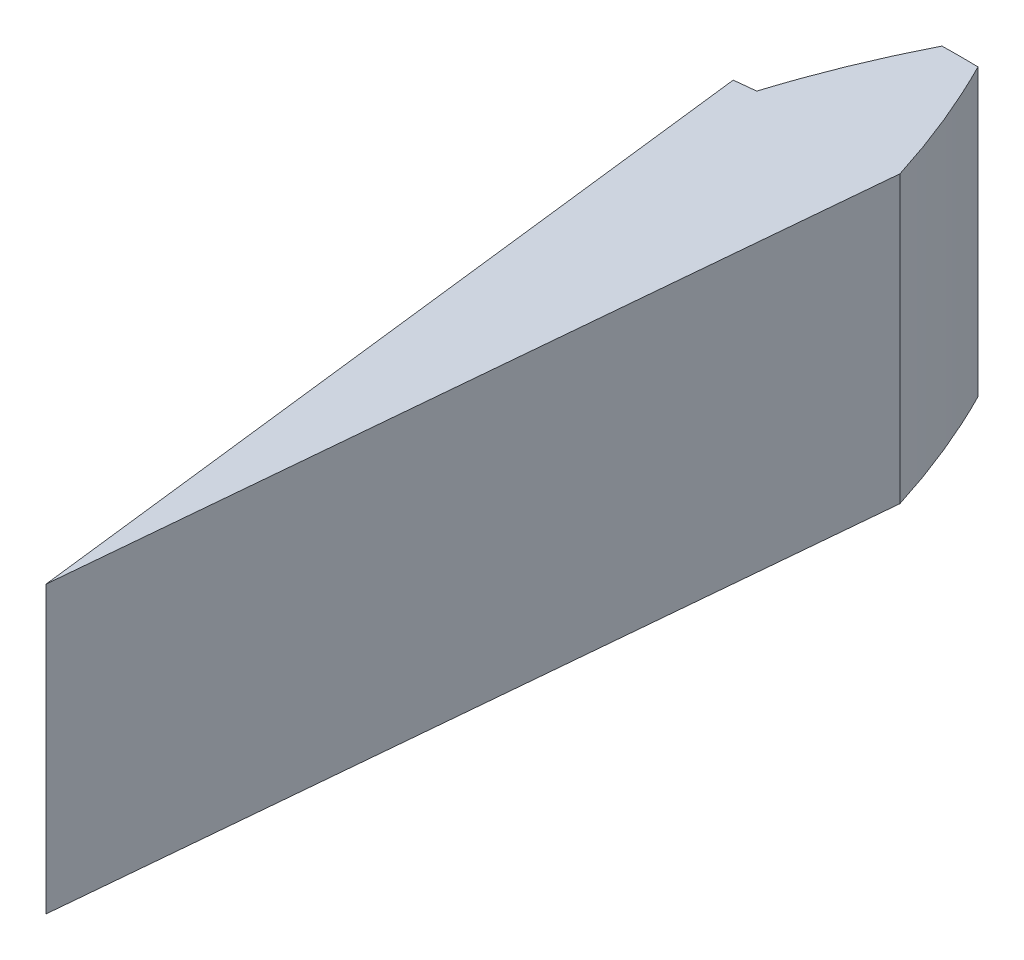
ISO-10303-21;
HEADER;
FILE_DESCRIPTION(('STEP AP214'),'2;1');
FILE_NAME('part.step','',(''),(''),'','','');
FILE_SCHEMA(('AUTOMOTIVE_DESIGN { 1 0 10303 214 1 1 1 1 }'));
ENDSEC;
DATA;
#1=APPLICATION_CONTEXT('core data for automotive mechanical design processes');
#2=APPLICATION_PROTOCOL_DEFINITION('international standard','automotive_design',2000,#1);
#3=PRODUCT_CONTEXT('',#1,'mechanical');
#4=PRODUCT('Part','Part','',(#3));
#5=PRODUCT_RELATED_PRODUCT_CATEGORY('part','',(#4));
#6=PRODUCT_DEFINITION_FORMATION('','',#4);
#7=PRODUCT_DEFINITION_CONTEXT('part definition',#1,'design');
#8=PRODUCT_DEFINITION('design','',#6,#7);
#9=PRODUCT_DEFINITION_SHAPE('','',#8);
#10=(LENGTH_UNIT() NAMED_UNIT(*) SI_UNIT(.MILLI.,.METRE.));
#11=(NAMED_UNIT(*) PLANE_ANGLE_UNIT() SI_UNIT($,.RADIAN.));
#12=(NAMED_UNIT(*) SI_UNIT($,.STERADIAN.) SOLID_ANGLE_UNIT());
#13=UNCERTAINTY_MEASURE_WITH_UNIT(LENGTH_MEASURE(1.E-05),#10,'distance_accuracy_value','');
#14=(GEOMETRIC_REPRESENTATION_CONTEXT(3) GLOBAL_UNCERTAINTY_ASSIGNED_CONTEXT((#13)) GLOBAL_UNIT_ASSIGNED_CONTEXT((#10,
#11,#12)) REPRESENTATION_CONTEXT('',''));
#15=CARTESIAN_POINT('',(0.,0.,0.));
#16=DIRECTION('',(0.,0.,1.));
#17=DIRECTION('',(1.,0.,0.));
#18=AXIS2_PLACEMENT_3D('',#15,#16,#17);
#19=CARTESIAN_POINT('',(0.,10.,0.));
#20=DIRECTION('',(0.,-1.,0.));
#21=DIRECTION('',(0.,0.,-1.));
#22=AXIS2_PLACEMENT_3D('',#19,#20,#21);
#23=CYLINDRICAL_SURFACE('',#22,27.5);
#24=CARTESIAN_POINT('',(0.,0.,0.));
#25=DIRECTION('',(0.,1.,0.));
#26=DIRECTION('',(0.,0.,-1.));
#27=AXIS2_PLACEMENT_3D('',#24,#25,#26);
#28=CIRCLE('',#27,27.5);
#29=CARTESIAN_POINT('',(-2.5074366627789,0.,-27.3854506317553));
#30=VERTEX_POINT('',#29);
#31=CARTESIAN_POINT('',(-3.25161592779197,0.,-27.3070868797485));
#32=VERTEX_POINT('',#31);
#33=EDGE_CURVE('E123',#30,#32,#28,.T.);
#34=ORIENTED_EDGE('',*,*,#33,.T.);
#35=DIRECTION('',(0.,-1.,0.));
#36=VECTOR('',#35,1.);
#37=CARTESIAN_POINT('',(-3.25161592779197,10.,-27.3070868797485));
#38=LINE('',#37,#36);
#39=CARTESIAN_POINT('',(-3.25161592779197,10.,-27.3070868797485));
#40=VERTEX_POINT('',#39);
#41=EDGE_CURVE('E11',#40,#32,#38,.T.);
#42=ORIENTED_EDGE('',*,*,#41,.F.);
#43=CARTESIAN_POINT('',(0.,10.,0.));
#44=DIRECTION('',(0.,1.,0.));
#45=DIRECTION('',(0.,0.,-1.));
#46=AXIS2_PLACEMENT_3D('',#43,#44,#45);
#47=CIRCLE('',#46,27.5);
#48=CARTESIAN_POINT('',(-2.5074366627789,10.,-27.3854506317553));
#49=VERTEX_POINT('',#48);
#50=EDGE_CURVE('E168',#49,#40,#47,.T.);
#51=ORIENTED_EDGE('',*,*,#50,.F.);
#52=DIRECTION('',(0.,-1.,0.));
#53=VECTOR('',#52,1.);
#54=CARTESIAN_POINT('',(-2.5074366627789,10.,-27.3854506317553));
#55=LINE('',#54,#53);
#56=EDGE_CURVE('E113',#49,#30,#55,.T.);
#57=ORIENTED_EDGE('',*,*,#56,.T.);
#58=EDGE_LOOP('',(#34,#42,#51,#57));
#59=FACE_BOUND('',#58,.T.);
#60=ADVANCED_FACE('F33',(#59),#23,.T.);
#61=CARTESIAN_POINT('',(-3.25161592779197,10.,-27.3070868797485));
#62=DIRECTION('',(0.992984977445398,0.,-0.118240579192435));
#63=DIRECTION('',(-0.118240579192435,0.,-0.992984977445398));
#64=AXIS2_PLACEMENT_3D('',#61,#62,#63);
#65=PLANE('',#64);
#66=DIRECTION('',(0.118240579192435,0.,0.992984977445398));
#67=VECTOR('',#66,1.);
#68=CARTESIAN_POINT('',(-3.25161592779197,0.,-27.3070868797485));
#69=LINE('',#68,#67);
#70=CARTESIAN_POINT('',(0.,0.,0.));
#71=VERTEX_POINT('',#70);
#72=EDGE_CURVE('E148',#32,#71,#69,.T.);
#73=ORIENTED_EDGE('',*,*,#72,.T.);
#74=DIRECTION('',(0.,-1.,0.));
#75=VECTOR('',#74,1.);
#76=CARTESIAN_POINT('',(0.,10.,0.));
#77=LINE('',#76,#75);
#78=CARTESIAN_POINT('',(0.,10.,0.));
#79=VERTEX_POINT('',#78);
#80=EDGE_CURVE('E41',#79,#71,#77,.T.);
#81=ORIENTED_EDGE('',*,*,#80,.F.);
#82=DIRECTION('',(0.118240579192435,0.,0.992984977445398));
#83=VECTOR('',#82,1.);
#84=CARTESIAN_POINT('',(-3.25161592779197,10.,-27.3070868797485));
#85=LINE('',#84,#83);
#86=EDGE_CURVE('E86',#40,#79,#85,.T.);
#87=ORIENTED_EDGE('',*,*,#86,.F.);
#88=ORIENTED_EDGE('',*,*,#41,.T.);
#89=EDGE_LOOP('',(#73,#81,#87,#88));
#90=FACE_BOUND('',#89,.T.);
#91=ADVANCED_FACE('F141',(#90),#65,.F.);
#92=CARTESIAN_POINT('',(2.50743751561963,10.,-27.3854479076984));
#93=DIRECTION('',(-0.995834469370851,0.,-0.0911795460225319));
#94=DIRECTION('',(-0.0911795460225319,0.,0.995834469370851));
#95=AXIS2_PLACEMENT_3D('',#92,#93,#94);
#96=PLANE('',#95);
#97=DIRECTION('',(0.0911795460225319,0.,-0.995834469370851));
#98=VECTOR('',#97,1.);
#99=CARTESIAN_POINT('',(2.50743751561963,0.,-27.3854479076984));
#100=LINE('',#99,#98);
#101=CARTESIAN_POINT('',(2.50743751561963,0.,-27.3854479076984));
#102=VERTEX_POINT('',#101);
#103=EDGE_CURVE('E155',#71,#102,#100,.T.);
#104=ORIENTED_EDGE('',*,*,#103,.T.);
#105=DIRECTION('',(0.,-1.,0.));
#106=VECTOR('',#105,1.);
#107=CARTESIAN_POINT('',(2.50743751561963,10.,-27.3854479076984));
#108=LINE('',#107,#106);
#109=CARTESIAN_POINT('',(2.50743751561963,10.,-27.3854479076984));
#110=VERTEX_POINT('',#109);
#111=EDGE_CURVE('E108',#110,#102,#108,.T.);
#112=ORIENTED_EDGE('',*,*,#111,.F.);
#113=DIRECTION('',(0.0911795460225319,0.,-0.995834469370851));
#114=VECTOR('',#113,1.);
#115=CARTESIAN_POINT('',(2.50743751561963,10.,-27.3854479076984));
#116=LINE('',#115,#114);
#117=EDGE_CURVE('E99',#79,#110,#116,.T.);
#118=ORIENTED_EDGE('',*,*,#117,.F.);
#119=ORIENTED_EDGE('',*,*,#80,.T.);
#120=EDGE_LOOP('',(#104,#112,#118,#119));
#121=FACE_BOUND('',#120,.T.);
#122=ADVANCED_FACE('F139',(#121),#96,.F.);
#123=CARTESIAN_POINT('',(2.50743962073684,10.,-27.3854411837454));
#124=CARTESIAN_POINT('',(2.49265135368791,10.,-27.4326764017785));
#125=CARTESIAN_POINT('',(2.46357880134377,10.,-27.5244910985876));
#126=CARTESIAN_POINT('',(2.38987849834189,10.,-27.7551915455159));
#127=CARTESIAN_POINT('',(2.33082764690979,10.,-27.931248861365));
#128=CARTESIAN_POINT('',(2.24537817590708,10.,-28.1853644520058));
#129=CARTESIAN_POINT('',(2.17296099575413,10.,-28.3915556897808));
#130=CARTESIAN_POINT('',(2.08984460040957,10.,-28.6256892333198));
#131=CARTESIAN_POINT('',(2.01033927616984,10.,-28.841951084558));
#132=CARTESIAN_POINT('',(1.9258754985523,10.,-29.0678936528037));
#133=CARTESIAN_POINT('',(1.84150353076009,10.,-29.2870942907325));
#134=CARTESIAN_POINT('',(1.75442154252433,10.,-29.5089912703624));
#135=CARTESIAN_POINT('',(1.66592224717226,10.,-29.7286575857884));
#136=CARTESIAN_POINT('',(1.57591455612572,10.,-29.9477101615849));
#137=CARTESIAN_POINT('',(1.48333477911672,10.,-30.1673701878367));
#138=CARTESIAN_POINT('',(1.39069736438171,10.,-30.3832077610457));
#139=CARTESIAN_POINT('',(1.29341860460664,10.,-30.6039361388578));
#140=CARTESIAN_POINT('',(1.19934884542777,10.,-30.8142719781516));
#141=CARTESIAN_POINT('',(1.09538669677473,10.,-31.0399237519816));
#142=CARTESIAN_POINT('',(1.00327346051542,10.,-31.238101011581));
#143=CARTESIAN_POINT('',(0.887030570388414,10.,-31.4796873025752));
#144=CARTESIAN_POINT('',(0.806386938107843,10.,-31.6469588963722));
#145=CARTESIAN_POINT('',(0.698080505458318,10.,-31.8635787189238));
#146=CARTESIAN_POINT('',(0.654791134070661,10.,-31.9496088425713));
#147=CARTESIAN_POINT('',(0.632399763890536,10.,-31.9937504919106));
#148=B_SPLINE_CURVE_WITH_KNOTS('',4,(#123,#124,#125,#126,#127,#128,#129,#130,#131,#132,#133,
#134,#135,#136,#137,#138,#139,#140,#141,#142,#143,#144,#145,#146,#147),.UNSPECIFIED.,.F.,.F.,(5,
1,1,1,1,1,1,1,1,1,1,1,1,1,1,1,1,1,1,1,1,5),(0.0826391441138729,0.122386517209973,
0.162135304872081,0.201884092534187,0.241632880196294,0.2813816678584,0.321130455520506,
0.360879243182613,0.400628030844721,0.440376818506829,0.480125606168938,0.519874393831046,
0.559623181493152,0.59937196915526,0.639120756817367,0.678869544479473,0.718618332141579,
0.758367119803684,0.79811590746579,0.837864695127897,0.877613482790004,0.917362270452133),.UNSPECIFIED.);
#149=DIRECTION('',(0.,-1.,0.));
#150=VECTOR('',#149,1.);
#151=SURFACE_OF_LINEAR_EXTRUSION('',#148,#150);
#152=CARTESIAN_POINT('',(2.50743962073684,0.,-27.3854411837454));
#153=CARTESIAN_POINT('',(2.49265135368791,0.,-27.4326764017785));
#154=CARTESIAN_POINT('',(2.46357880134377,0.,-27.5244910985876));
#155=CARTESIAN_POINT('',(2.38987849834189,0.,-27.7551915455159));
#156=CARTESIAN_POINT('',(2.33082764690979,0.,-27.931248861365));
#157=CARTESIAN_POINT('',(2.24537817590708,0.,-28.1853644520058));
#158=CARTESIAN_POINT('',(2.17296099575413,0.,-28.3915556897808));
#159=CARTESIAN_POINT('',(2.08984460040957,0.,-28.6256892333198));
#160=CARTESIAN_POINT('',(2.01033927616984,0.,-28.841951084558));
#161=CARTESIAN_POINT('',(1.9258754985523,0.,-29.0678936528037));
#162=CARTESIAN_POINT('',(1.84150353076009,0.,-29.2870942907325));
#163=CARTESIAN_POINT('',(1.75442154252433,0.,-29.5089912703624));
#164=CARTESIAN_POINT('',(1.66592224717226,0.,-29.7286575857884));
#165=CARTESIAN_POINT('',(1.57591455612572,0.,-29.9477101615849));
#166=CARTESIAN_POINT('',(1.48333477911672,0.,-30.1673701878367));
#167=CARTESIAN_POINT('',(1.39069736438171,0.,-30.3832077610457));
#168=CARTESIAN_POINT('',(1.29341860460664,0.,-30.6039361388578));
#169=CARTESIAN_POINT('',(1.19934884542777,0.,-30.8142719781516));
#170=CARTESIAN_POINT('',(1.09538669677473,0.,-31.0399237519816));
#171=CARTESIAN_POINT('',(1.00327346051542,0.,-31.238101011581));
#172=CARTESIAN_POINT('',(0.887030570388414,0.,-31.4796873025752));
#173=CARTESIAN_POINT('',(0.806386938107843,0.,-31.6469588963722));
#174=CARTESIAN_POINT('',(0.698080505458318,0.,-31.8635787189238));
#175=CARTESIAN_POINT('',(0.654791134070661,0.,-31.9496088425713));
#176=CARTESIAN_POINT('',(0.632399763890536,0.,-31.9937504919106));
#177=B_SPLINE_CURVE_WITH_KNOTS('',4,(#152,#153,#154,#155,#156,#157,#158,#159,#160,#161,#162,
#163,#164,#165,#166,#167,#168,#169,#170,#171,#172,#173,#174,#175,#176),.UNSPECIFIED.,.F.,.F.,(5,
1,1,1,1,1,1,1,1,1,1,1,1,1,1,1,1,1,1,1,1,5),(0.0826391441138729,0.122386517209973,
0.162135304872081,0.201884092534187,0.241632880196294,0.2813816678584,0.321130455520506,
0.360879243182613,0.400628030844721,0.440376818506829,0.480125606168938,0.519874393831046,
0.559623181493152,0.59937196915526,0.639120756817367,0.678869544479473,0.718618332141579,
0.758367119803684,0.79811590746579,0.837864695127897,0.877613482790004,0.917362270452133),.UNSPECIFIED.);
#178=CARTESIAN_POINT('',(0.632399763890536,0.,-31.9937504919106));
#179=VERTEX_POINT('',#178);
#180=EDGE_CURVE('E107',#102,#179,#177,.T.);
#181=ORIENTED_EDGE('',*,*,#180,.T.);
#182=DIRECTION('',(0.,-1.,0.));
#183=VECTOR('',#182,1.);
#184=CARTESIAN_POINT('',(0.632399763890536,10.,-31.9937504919106));
#185=LINE('',#184,#183);
#186=CARTESIAN_POINT('',(0.632399763890536,10.,-31.9937504919106));
#187=VERTEX_POINT('',#186);
#188=EDGE_CURVE('E104',#187,#179,#185,.T.);
#189=ORIENTED_EDGE('',*,*,#188,.F.);
#190=EDGE_CURVE('E93',#110,#187,#148,.T.);
#191=ORIENTED_EDGE('',*,*,#190,.F.);
#192=ORIENTED_EDGE('',*,*,#111,.T.);
#193=EDGE_LOOP('',(#181,#189,#191,#192));
#194=FACE_BOUND('',#193,.T.);
#195=ADVANCED_FACE('F105',(#194),#151,.F.);
#196=CARTESIAN_POINT('',(0.,10.,0.));
#197=DIRECTION('',(0.,-1.,0.));
#198=DIRECTION('',(0.,0.,-1.));
#199=AXIS2_PLACEMENT_3D('',#196,#197,#198);
#200=CYLINDRICAL_SURFACE('',#199,32.0000000000001);
#201=CARTESIAN_POINT('',(0.,0.,0.));
#202=DIRECTION('',(0.,1.,0.));
#203=DIRECTION('',(0.,0.,-1.));
#204=AXIS2_PLACEMENT_3D('',#201,#202,#203);
#205=CIRCLE('',#204,32.0000000000001);
#206=CARTESIAN_POINT('',(-0.632399763326191,0.,-31.9937504919218));
#207=VERTEX_POINT('',#206);
#208=EDGE_CURVE('E72',#179,#207,#205,.T.);
#209=ORIENTED_EDGE('',*,*,#208,.T.);
#210=DIRECTION('',(0.,-1.,0.));
#211=VECTOR('',#210,1.);
#212=CARTESIAN_POINT('',(-0.632399763326191,10.,-31.9937504919218));
#213=LINE('',#212,#211);
#214=CARTESIAN_POINT('',(-0.632399763326191,10.,-31.9937504919218));
#215=VERTEX_POINT('',#214);
#216=EDGE_CURVE('E109',#215,#207,#213,.T.);
#217=ORIENTED_EDGE('',*,*,#216,.F.);
#218=CARTESIAN_POINT('',(0.,10.,0.));
#219=DIRECTION('',(0.,1.,0.));
#220=DIRECTION('',(0.,0.,-1.));
#221=AXIS2_PLACEMENT_3D('',#218,#219,#220);
#222=CIRCLE('',#221,32.0000000000001);
#223=EDGE_CURVE('E97',#187,#215,#222,.T.);
#224=ORIENTED_EDGE('',*,*,#223,.F.);
#225=ORIENTED_EDGE('',*,*,#188,.T.);
#226=EDGE_LOOP('',(#209,#217,#224,#225));
#227=FACE_BOUND('',#226,.T.);
#228=ADVANCED_FACE('F111',(#227),#200,.T.);
#229=CARTESIAN_POINT('',(-0.632399763325658,10.,-31.9937504919228));
#230=CARTESIAN_POINT('',(-0.654791089005791,10.,-31.9496089303212));
#231=CARTESIAN_POINT('',(-0.698080374914685,10.,-31.8635789779529));
#232=CARTESIAN_POINT('',(-0.806386594817153,10.,-31.6469595872162));
#233=CARTESIAN_POINT('',(-0.887030073528253,10.,-31.4796883291725));
#234=CARTESIAN_POINT('',(-1.00327274271659,10.,-31.2381025231951));
#235=CARTESIAN_POINT('',(-1.09538580942082,10.,-31.039925663835));
#236=CARTESIAN_POINT('',(-1.19934776838447,10.,-30.8142743462927));
#237=CARTESIAN_POINT('',(-1.29341736103495,10.,-30.6039389342486));
#238=CARTESIAN_POINT('',(-1.39069595132436,10.,-30.3832110056608));
#239=CARTESIAN_POINT('',(-1.48333320940981,10.,-30.1673738732711));
#240=CARTESIAN_POINT('',(-1.57591283323881,10.,-29.9477142966105));
#241=CARTESIAN_POINT('',(-1.66592038005187,10.,-29.7286621704605));
#242=CARTESIAN_POINT('',(-1.7544195372677,10.,-29.5089963068716));
#243=CARTESIAN_POINT('',(-1.8415013945466,10.,-29.2870997848172));
#244=CARTESIAN_POINT('',(-1.92587323910125,10.,-29.0678995997117));
#245=CARTESIAN_POINT('',(-2.01033689902737,10.,-28.8419574992983));
#246=CARTESIAN_POINT('',(-2.08984211560593,10.,-28.625696096459));
#247=CARTESIAN_POINT('',(-2.17295840549628,10.,-28.3915630394702));
#248=CARTESIAN_POINT('',(-2.24537549568723,10.,-28.1853722305291));
#249=CARTESIAN_POINT('',(-2.33082487014891,10.,-27.9312571695942));
#250=CARTESIAN_POINT('',(-2.38987565524617,10.,-27.7552002208381));
#251=CARTESIAN_POINT('',(-2.46357588525483,10.,-27.5245002559292));
#252=CARTESIAN_POINT('',(-2.49264840953036,10.,-27.4326857510221));
#253=CARTESIAN_POINT('',(-2.5074366627789,10.,-27.3854506317553));
#254=B_SPLINE_CURVE_WITH_KNOTS('',4,(#229,#230,#231,#232,#233,#234,#235,#236,#237,#238,#239,
#240,#241,#242,#243,#244,#245,#246,#247,#248,#249,#250,#251,#252,#253),.UNSPECIFIED.,.F.,.F.,(5,
1,1,1,1,1,1,1,1,1,1,1,1,1,1,1,1,1,1,1,1,5),(0.0826377295478504,0.122386517209951,
0.162135304872051,0.20188409253415,0.24163288019625,0.281381667858349,0.321130455520448,
0.360879243182547,0.400628030844646,0.440376818506746,0.480125606168845,0.519874393830945,
0.559623181493044,0.599371969155143,0.639120756817242,0.67886954447934,0.71861833214144,
0.75836711980354,0.798115907465638,0.837864695127737,0.877613482789837,0.917362843531454),.UNSPECIFIED.);
#255=DIRECTION('',(0.,-1.,0.));
#256=VECTOR('',#255,1.);
#257=SURFACE_OF_LINEAR_EXTRUSION('',#254,#256);
#258=CARTESIAN_POINT('',(-0.632399763325658,0.,-31.9937504919228));
#259=CARTESIAN_POINT('',(-0.654791089005791,0.,-31.9496089303212));
#260=CARTESIAN_POINT('',(-0.698080374914685,0.,-31.8635789779529));
#261=CARTESIAN_POINT('',(-0.806386594817153,0.,-31.6469595872162));
#262=CARTESIAN_POINT('',(-0.887030073528253,0.,-31.4796883291725));
#263=CARTESIAN_POINT('',(-1.00327274271659,0.,-31.2381025231951));
#264=CARTESIAN_POINT('',(-1.09538580942082,0.,-31.039925663835));
#265=CARTESIAN_POINT('',(-1.19934776838447,0.,-30.8142743462927));
#266=CARTESIAN_POINT('',(-1.29341736103495,0.,-30.6039389342486));
#267=CARTESIAN_POINT('',(-1.39069595132436,0.,-30.3832110056608));
#268=CARTESIAN_POINT('',(-1.48333320940981,0.,-30.1673738732711));
#269=CARTESIAN_POINT('',(-1.57591283323881,0.,-29.9477142966105));
#270=CARTESIAN_POINT('',(-1.66592038005187,0.,-29.7286621704605));
#271=CARTESIAN_POINT('',(-1.7544195372677,0.,-29.5089963068716));
#272=CARTESIAN_POINT('',(-1.8415013945466,0.,-29.2870997848172));
#273=CARTESIAN_POINT('',(-1.92587323910125,0.,-29.0678995997117));
#274=CARTESIAN_POINT('',(-2.01033689902737,0.,-28.8419574992983));
#275=CARTESIAN_POINT('',(-2.08984211560593,0.,-28.625696096459));
#276=CARTESIAN_POINT('',(-2.17295840549628,0.,-28.3915630394702));
#277=CARTESIAN_POINT('',(-2.24537549568723,0.,-28.1853722305291));
#278=CARTESIAN_POINT('',(-2.33082487014891,0.,-27.9312571695942));
#279=CARTESIAN_POINT('',(-2.38987565524617,0.,-27.7552002208381));
#280=CARTESIAN_POINT('',(-2.46357588525483,0.,-27.5245002559292));
#281=CARTESIAN_POINT('',(-2.49264840953036,0.,-27.4326857510221));
#282=CARTESIAN_POINT('',(-2.5074366627789,0.,-27.3854506317553));
#283=B_SPLINE_CURVE_WITH_KNOTS('',4,(#258,#259,#260,#261,#262,#263,#264,#265,#266,#267,#268,
#269,#270,#271,#272,#273,#274,#275,#276,#277,#278,#279,#280,#281,#282),.UNSPECIFIED.,.F.,.F.,(5,
1,1,1,1,1,1,1,1,1,1,1,1,1,1,1,1,1,1,1,1,5),(0.0826377295478504,0.122386517209951,
0.162135304872051,0.20188409253415,0.24163288019625,0.281381667858349,0.321130455520448,
0.360879243182547,0.400628030844646,0.440376818506746,0.480125606168845,0.519874393830945,
0.559623181493044,0.599371969155143,0.639120756817242,0.67886954447934,0.71861833214144,
0.75836711980354,0.798115907465638,0.837864695127737,0.877613482789837,0.917362843531454),.UNSPECIFIED.);
#284=EDGE_CURVE('E78',#207,#30,#283,.T.);
#285=ORIENTED_EDGE('',*,*,#284,.T.);
#286=ORIENTED_EDGE('',*,*,#56,.F.);
#287=EDGE_CURVE('E49',#215,#49,#254,.T.);
#288=ORIENTED_EDGE('',*,*,#287,.F.);
#289=ORIENTED_EDGE('',*,*,#216,.T.);
#290=EDGE_LOOP('',(#285,#286,#288,#289));
#291=FACE_BOUND('',#290,.T.);
#292=ADVANCED_FACE('F129',(#291),#257,.F.);
#293=CARTESIAN_POINT('',(0.,10.,0.));
#294=DIRECTION('',(0.,-1.,0.));
#295=DIRECTION('',(0.,0.,-1.));
#296=AXIS2_PLACEMENT_3D('',#293,#294,#295);
#297=PLANE('',#296);
#298=ORIENTED_EDGE('',*,*,#50,.T.);
#299=ORIENTED_EDGE('',*,*,#86,.T.);
#300=ORIENTED_EDGE('',*,*,#117,.T.);
#301=ORIENTED_EDGE('',*,*,#190,.T.);
#302=ORIENTED_EDGE('',*,*,#223,.T.);
#303=ORIENTED_EDGE('',*,*,#287,.T.);
#304=EDGE_LOOP('',(#298,#299,#300,#301,#302,#303));
#305=FACE_BOUND('',#304,.T.);
#306=ADVANCED_FACE('F95',(#305),#297,.F.);
#307=CARTESIAN_POINT('',(0.,0.,0.));
#308=DIRECTION('',(0.,-1.,0.));
#309=DIRECTION('',(0.,0.,-1.));
#310=AXIS2_PLACEMENT_3D('',#307,#308,#309);
#311=PLANE('',#310);
#312=ORIENTED_EDGE('',*,*,#33,.F.);
#313=ORIENTED_EDGE('',*,*,#284,.F.);
#314=ORIENTED_EDGE('',*,*,#208,.F.);
#315=ORIENTED_EDGE('',*,*,#180,.F.);
#316=ORIENTED_EDGE('',*,*,#103,.F.);
#317=ORIENTED_EDGE('',*,*,#72,.F.);
#318=EDGE_LOOP('',(#312,#313,#314,#315,#316,#317));
#319=FACE_BOUND('',#318,.T.);
#320=ADVANCED_FACE('F133',(#319),#311,.T.);
#321=CLOSED_SHELL('',(#60,#91,#122,#195,#228,#292,#306,#320));
#322=MANIFOLD_SOLID_BREP('B2',#321);
#323=ADVANCED_BREP_SHAPE_REPRESENTATION('',(#18,#322),#14);
#324=SHAPE_DEFINITION_REPRESENTATION(#9,#323);
ENDSEC;
END-ISO-10303-21;
